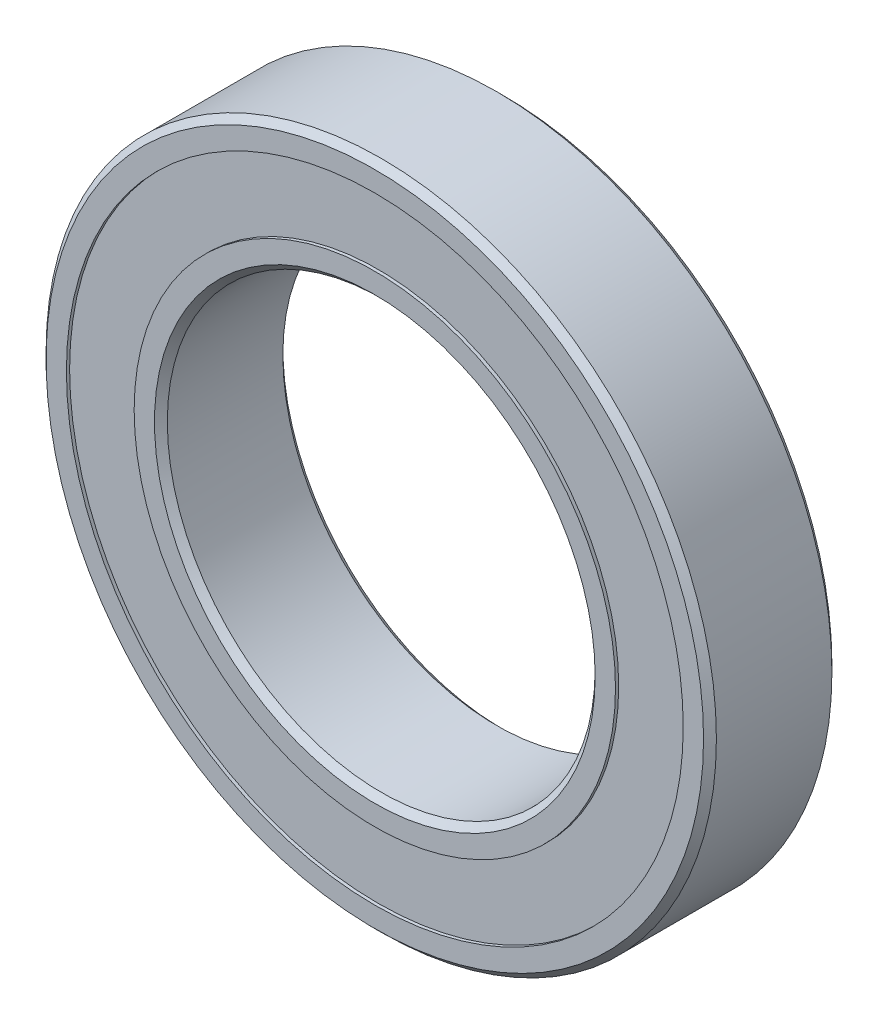
ISO-10303-21;
HEADER;
FILE_DESCRIPTION(('STEP AP214'),'2;1');
FILE_NAME('part.step','',(''),(''),'','','');
FILE_SCHEMA(('AUTOMOTIVE_DESIGN { 1 0 10303 214 1 1 1 1 }'));
ENDSEC;
DATA;
#1=APPLICATION_CONTEXT('core data for automotive mechanical design processes');
#2=APPLICATION_PROTOCOL_DEFINITION('international standard','automotive_design',2000,#1);
#3=PRODUCT_CONTEXT('',#1,'mechanical');
#4=PRODUCT('Part','Part','',(#3));
#5=PRODUCT_RELATED_PRODUCT_CATEGORY('part','',(#4));
#6=PRODUCT_DEFINITION_FORMATION('','',#4);
#7=PRODUCT_DEFINITION_CONTEXT('part definition',#1,'design');
#8=PRODUCT_DEFINITION('design','',#6,#7);
#9=PRODUCT_DEFINITION_SHAPE('','',#8);
#10=(LENGTH_UNIT() NAMED_UNIT(*) SI_UNIT(.MILLI.,.METRE.));
#11=(NAMED_UNIT(*) PLANE_ANGLE_UNIT() SI_UNIT($,.RADIAN.));
#12=(NAMED_UNIT(*) SI_UNIT($,.STERADIAN.) SOLID_ANGLE_UNIT());
#13=UNCERTAINTY_MEASURE_WITH_UNIT(LENGTH_MEASURE(1.E-05),#10,'distance_accuracy_value','');
#14=(GEOMETRIC_REPRESENTATION_CONTEXT(3) GLOBAL_UNCERTAINTY_ASSIGNED_CONTEXT((#13)) GLOBAL_UNIT_ASSIGNED_CONTEXT((#10,
#11,#12)) REPRESENTATION_CONTEXT('',''));
#15=CARTESIAN_POINT('',(0.,0.,0.));
#16=DIRECTION('',(0.,0.,1.));
#17=DIRECTION('',(1.,0.,0.));
#18=AXIS2_PLACEMENT_3D('',#15,#16,#17);
#19=CARTESIAN_POINT('',(0.,21.62475,-4.275));
#20=DIRECTION('',(0.,0.,1.));
#21=DIRECTION('',(1.,0.,0.));
#22=AXIS2_PLACEMENT_3D('',#19,#20,#21);
#23=PLANE('',#22);
#24=CARTESIAN_POINT('',(0.,0.,-4.275));
#25=DIRECTION('',(0.,0.,1.));
#26=DIRECTION('',(1.,0.,0.));
#27=AXIS2_PLACEMENT_3D('',#24,#25,#26);
#28=CIRCLE('',#27,21.62475);
#29=CARTESIAN_POINT('',(21.62475,0.,-4.275));
#30=VERTEX_POINT('',#29);
#31=EDGE_CURVE('E57',#30,#30,#28,.T.);
#32=ORIENTED_EDGE('',*,*,#31,.F.);
#33=EDGE_LOOP('',(#32));
#34=FACE_BOUND('',#33,.T.);
#35=CARTESIAN_POINT('',(0.,0.,-4.275));
#36=DIRECTION('',(0.,0.,1.));
#37=DIRECTION('',(1.,0.,0.));
#38=AXIS2_PLACEMENT_3D('',#35,#36,#37);
#39=CIRCLE('',#38,16.87475);
#40=CARTESIAN_POINT('',(16.87475,0.,-4.275));
#41=VERTEX_POINT('',#40);
#42=EDGE_CURVE('E11',#41,#41,#39,.T.);
#43=ORIENTED_EDGE('',*,*,#42,.T.);
#44=EDGE_LOOP('',(#43));
#45=FACE_BOUND('',#44,.T.);
#46=ADVANCED_FACE('F43',(#34,#45),#23,.F.);
#47=CARTESIAN_POINT('',(0.,0.,4.5));
#48=DIRECTION('',(0.,0.,1.));
#49=DIRECTION('',(1.,0.,0.));
#50=AXIS2_PLACEMENT_3D('',#47,#48,#49);
#51=CYLINDRICAL_SURFACE('',#50,16.87475);
#52=ORIENTED_EDGE('',*,*,#42,.F.);
#53=EDGE_LOOP('',(#52));
#54=FACE_BOUND('',#53,.T.);
#55=CARTESIAN_POINT('',(0.,0.,-3.10493558709355));
#56=DIRECTION('',(0.,0.,1.));
#57=DIRECTION('',(1.,0.,0.));
#58=AXIS2_PLACEMENT_3D('',#55,#56,#57);
#59=CIRCLE('',#58,16.87475);
#60=CARTESIAN_POINT('',(16.87475,0.,-3.10493558709355));
#61=VERTEX_POINT('',#60);
#62=EDGE_CURVE('E49',#61,#61,#59,.T.);
#63=ORIENTED_EDGE('',*,*,#62,.T.);
#64=EDGE_LOOP('',(#63));
#65=FACE_BOUND('',#64,.T.);
#66=ADVANCED_FACE('F66',(#54,#65),#51,.F.);
#67=CARTESIAN_POINT('',(0.,21.62475,-3.10493558709355));
#68=DIRECTION('',(0.,0.,-1.));
#69=DIRECTION('',(-1.,0.,0.));
#70=AXIS2_PLACEMENT_3D('',#67,#68,#69);
#71=PLANE('',#70);
#72=ORIENTED_EDGE('',*,*,#62,.F.);
#73=EDGE_LOOP('',(#72));
#74=FACE_BOUND('',#73,.T.);
#75=CARTESIAN_POINT('',(0.,0.,-3.10493558709355));
#76=DIRECTION('',(0.,0.,1.));
#77=DIRECTION('',(1.,0.,0.));
#78=AXIS2_PLACEMENT_3D('',#75,#76,#77);
#79=CIRCLE('',#78,21.62475);
#80=CARTESIAN_POINT('',(21.62475,0.,-3.10493558709355));
#81=VERTEX_POINT('',#80);
#82=EDGE_CURVE('E53',#81,#81,#79,.T.);
#83=ORIENTED_EDGE('',*,*,#82,.T.);
#84=EDGE_LOOP('',(#83));
#85=FACE_BOUND('',#84,.T.);
#86=ADVANCED_FACE('F70',(#74,#85),#71,.F.);
#87=CARTESIAN_POINT('',(0.,0.,4.5));
#88=DIRECTION('',(0.,0.,1.));
#89=DIRECTION('',(1.,0.,0.));
#90=AXIS2_PLACEMENT_3D('',#87,#88,#89);
#91=CYLINDRICAL_SURFACE('',#90,21.62475);
#92=ORIENTED_EDGE('',*,*,#82,.F.);
#93=EDGE_LOOP('',(#92));
#94=FACE_BOUND('',#93,.T.);
#95=ORIENTED_EDGE('',*,*,#31,.T.);
#96=EDGE_LOOP('',(#95));
#97=FACE_BOUND('',#96,.T.);
#98=ADVANCED_FACE('F63',(#94,#97),#91,.T.);
#99=CLOSED_SHELL('',(#46,#66,#86,#98));
#100=MANIFOLD_SOLID_BREP('B2',#99);
#101=CARTESIAN_POINT('',(0.,21.62475,4.275));
#102=DIRECTION('',(0.,0.,-1.));
#103=DIRECTION('',(-1.,0.,0.));
#104=AXIS2_PLACEMENT_3D('',#101,#102,#103);
#105=PLANE('',#104);
#106=CARTESIAN_POINT('',(0.,0.,4.275));
#107=DIRECTION('',(0.,0.,1.));
#108=DIRECTION('',(1.,0.,0.));
#109=AXIS2_PLACEMENT_3D('',#106,#107,#108);
#110=CIRCLE('',#109,16.87475);
#111=CARTESIAN_POINT('',(16.87475,0.,4.275));
#112=VERTEX_POINT('',#111);
#113=EDGE_CURVE('E42',#112,#112,#110,.T.);
#114=ORIENTED_EDGE('',*,*,#113,.F.);
#115=EDGE_LOOP('',(#114));
#116=FACE_BOUND('',#115,.T.);
#117=CARTESIAN_POINT('',(0.,0.,4.275));
#118=DIRECTION('',(0.,0.,1.));
#119=DIRECTION('',(1.,0.,0.));
#120=AXIS2_PLACEMENT_3D('',#117,#118,#119);
#121=CIRCLE('',#120,21.62475);
#122=CARTESIAN_POINT('',(21.62475,0.,4.275));
#123=VERTEX_POINT('',#122);
#124=EDGE_CURVE('E124',#123,#123,#121,.T.);
#125=ORIENTED_EDGE('',*,*,#124,.T.);
#126=EDGE_LOOP('',(#125));
#127=FACE_BOUND('',#126,.T.);
#128=ADVANCED_FACE('F110',(#116,#127),#105,.F.);
#129=CARTESIAN_POINT('',(0.,0.,4.5));
#130=DIRECTION('',(0.,0.,1.));
#131=DIRECTION('',(1.,0.,0.));
#132=AXIS2_PLACEMENT_3D('',#129,#130,#131);
#133=CYLINDRICAL_SURFACE('',#132,16.87475);
#134=CARTESIAN_POINT('',(0.,0.,3.10493558709355));
#135=DIRECTION('',(0.,0.,1.));
#136=DIRECTION('',(1.,0.,0.));
#137=AXIS2_PLACEMENT_3D('',#134,#135,#136);
#138=CIRCLE('',#137,16.87475);
#139=CARTESIAN_POINT('',(16.87475,0.,3.10493558709355));
#140=VERTEX_POINT('',#139);
#141=EDGE_CURVE('E116',#140,#140,#138,.T.);
#142=ORIENTED_EDGE('',*,*,#141,.F.);
#143=EDGE_LOOP('',(#142));
#144=FACE_BOUND('',#143,.T.);
#145=ORIENTED_EDGE('',*,*,#113,.T.);
#146=EDGE_LOOP('',(#145));
#147=FACE_BOUND('',#146,.T.);
#148=ADVANCED_FACE('F139',(#144,#147),#133,.F.);
#149=CARTESIAN_POINT('',(0.,21.62475,3.10493558709355));
#150=DIRECTION('',(0.,0.,1.));
#151=DIRECTION('',(1.,0.,0.));
#152=AXIS2_PLACEMENT_3D('',#149,#150,#151);
#153=PLANE('',#152);
#154=CARTESIAN_POINT('',(0.,0.,3.10493558709355));
#155=DIRECTION('',(0.,0.,1.));
#156=DIRECTION('',(1.,0.,0.));
#157=AXIS2_PLACEMENT_3D('',#154,#155,#156);
#158=CIRCLE('',#157,21.62475);
#159=CARTESIAN_POINT('',(21.62475,0.,3.10493558709355));
#160=VERTEX_POINT('',#159);
#161=EDGE_CURVE('E120',#160,#160,#158,.T.);
#162=ORIENTED_EDGE('',*,*,#161,.F.);
#163=EDGE_LOOP('',(#162));
#164=FACE_BOUND('',#163,.T.);
#165=ORIENTED_EDGE('',*,*,#141,.T.);
#166=EDGE_LOOP('',(#165));
#167=FACE_BOUND('',#166,.T.);
#168=ADVANCED_FACE('F134',(#164,#167),#153,.F.);
#169=CARTESIAN_POINT('',(0.,0.,4.5));
#170=DIRECTION('',(0.,0.,1.));
#171=DIRECTION('',(1.,0.,0.));
#172=AXIS2_PLACEMENT_3D('',#169,#170,#171);
#173=CYLINDRICAL_SURFACE('',#172,21.62475);
#174=ORIENTED_EDGE('',*,*,#124,.F.);
#175=EDGE_LOOP('',(#174));
#176=FACE_BOUND('',#175,.T.);
#177=ORIENTED_EDGE('',*,*,#161,.T.);
#178=EDGE_LOOP('',(#177));
#179=FACE_BOUND('',#178,.T.);
#180=ADVANCED_FACE('F131',(#176,#179),#173,.T.);
#181=CLOSED_SHELL('',(#128,#148,#168,#180));
#182=MANIFOLD_SOLID_BREP('B6',#181);
#183=CARTESIAN_POINT('',(-9.62487499999979,16.6707725164996,0.));
#184=DIRECTION('',(0.,0.,1.));
#185=DIRECTION('',(-0.499999999999989,0.866025403784445,0.));
#186=AXIS2_PLACEMENT_3D('',#183,#184,#185);
#187=SPHERICAL_SURFACE('',#186,3.10493558709355);
#188=CARTESIAN_POINT('',(-9.62487499999979,16.6707725164996,3.10493558709355));
#189=VERTEX_POINT('',#188);
#190=VERTEX_LOOP('',#189);
#191=FACE_BOUND('',#190,.T.);
#192=ADVANCED_FACE('F177',(#191),#187,.T.);
#193=CLOSED_SHELL('',(#192));
#194=MANIFOLD_SOLID_BREP('B37',#193);
#195=CARTESIAN_POINT('',(-16.6707725164994,9.6248750000002,0.));
#196=DIRECTION('',(0.,0.,1.));
#197=DIRECTION('',(-0.866025403784433,0.50000000000001,0.));
#198=AXIS2_PLACEMENT_3D('',#195,#196,#197);
#199=SPHERICAL_SURFACE('',#198,3.10493558709355);
#200=CARTESIAN_POINT('',(-16.6707725164994,9.6248750000002,3.10493558709355));
#201=VERTEX_POINT('',#200);
#202=VERTEX_LOOP('',#201);
#203=FACE_BOUND('',#202,.T.);
#204=ADVANCED_FACE('F197',(#203),#199,.T.);
#205=CLOSED_SHELL('',(#204));
#206=MANIFOLD_SOLID_BREP('B106',#205);
#207=CARTESIAN_POINT('',(-19.24975,2.01630428707187E-13,0.));
#208=DIRECTION('',(0.,0.,1.));
#209=DIRECTION('',(-1.,0.,0.));
#210=AXIS2_PLACEMENT_3D('',#207,#208,#209);
#211=SPHERICAL_SURFACE('',#210,3.10493558709355);
#212=CARTESIAN_POINT('',(-19.24975,2.01630428707187E-13,3.10493558709355));
#213=VERTEX_POINT('',#212);
#214=VERTEX_LOOP('',#213);
#215=FACE_BOUND('',#214,.T.);
#216=ADVANCED_FACE('F217',(#215),#211,.T.);
#217=CLOSED_SHELL('',(#216));
#218=MANIFOLD_SOLID_BREP('B173',#217);
#219=CARTESIAN_POINT('',(-16.6707725164996,-9.62487499999985,0.));
#220=DIRECTION('',(0.,0.,1.));
#221=DIRECTION('',(-0.866025403784443,-0.499999999999992,0.));
#222=AXIS2_PLACEMENT_3D('',#219,#220,#221);
#223=SPHERICAL_SURFACE('',#222,3.10493558709355);
#224=CARTESIAN_POINT('',(-16.6707725164996,-9.62487499999985,3.10493558709355));
#225=VERTEX_POINT('',#224);
#226=VERTEX_LOOP('',#225);
#227=FACE_BOUND('',#226,.T.);
#228=ADVANCED_FACE('F237',(#227),#223,.T.);
#229=CLOSED_SHELL('',(#228));
#230=MANIFOLD_SOLID_BREP('B193',#229);
#231=CARTESIAN_POINT('',(-9.62487500000014,-16.6707725164994,0.));
#232=DIRECTION('',(0.,0.,1.));
#233=DIRECTION('',(-0.500000000000007,-0.866025403784435,0.));
#234=AXIS2_PLACEMENT_3D('',#231,#232,#233);
#235=SPHERICAL_SURFACE('',#234,3.10493558709355);
#236=CARTESIAN_POINT('',(-9.62487500000014,-16.6707725164994,3.10493558709355));
#237=VERTEX_POINT('',#236);
#238=VERTEX_LOOP('',#237);
#239=FACE_BOUND('',#238,.T.);
#240=ADVANCED_FACE('F257',(#239),#235,.T.);
#241=CLOSED_SHELL('',(#240));
#242=MANIFOLD_SOLID_BREP('B213',#241);
#243=CARTESIAN_POINT('',(-1.34420285804791E-13,-19.24975,0.));
#244=DIRECTION('',(0.,0.,1.));
#245=DIRECTION('',(0.,-1.,0.));
#246=AXIS2_PLACEMENT_3D('',#243,#244,#245);
#247=SPHERICAL_SURFACE('',#246,3.10493558709355);
#248=CARTESIAN_POINT('',(-1.34420285804791E-13,-19.24975,3.10493558709355));
#249=VERTEX_POINT('',#248);
#250=VERTEX_LOOP('',#249);
#251=FACE_BOUND('',#250,.T.);
#252=ADVANCED_FACE('F277',(#251),#247,.T.);
#253=CLOSED_SHELL('',(#252));
#254=MANIFOLD_SOLID_BREP('B233',#253);
#255=CARTESIAN_POINT('',(9.6248749999999,-16.6707725164996,0.));
#256=DIRECTION('',(0.,0.,1.));
#257=DIRECTION('',(0.499999999999995,-0.866025403784442,0.));
#258=AXIS2_PLACEMENT_3D('',#255,#256,#257);
#259=SPHERICAL_SURFACE('',#258,3.10493558709355);
#260=CARTESIAN_POINT('',(9.6248749999999,-16.6707725164996,3.10493558709355));
#261=VERTEX_POINT('',#260);
#262=VERTEX_LOOP('',#261);
#263=FACE_BOUND('',#262,.T.);
#264=ADVANCED_FACE('F297',(#263),#259,.T.);
#265=CLOSED_SHELL('',(#264));
#266=MANIFOLD_SOLID_BREP('B253',#265);
#267=CARTESIAN_POINT('',(16.6707725164995,-9.62487500000008,0.));
#268=DIRECTION('',(0.,0.,1.));
#269=DIRECTION('',(0.866025403784436,-0.500000000000004,0.));
#270=AXIS2_PLACEMENT_3D('',#267,#268,#269);
#271=SPHERICAL_SURFACE('',#270,3.10493558709355);
#272=CARTESIAN_POINT('',(16.6707725164995,-9.62487500000008,3.10493558709355));
#273=VERTEX_POINT('',#272);
#274=VERTEX_LOOP('',#273);
#275=FACE_BOUND('',#274,.T.);
#276=ADVANCED_FACE('F317',(#275),#271,.T.);
#277=CLOSED_SHELL('',(#276));
#278=MANIFOLD_SOLID_BREP('B273',#277);
#279=CARTESIAN_POINT('',(19.24975,0.,0.));
#280=DIRECTION('',(0.,0.,1.));
#281=DIRECTION('',(1.,0.,0.));
#282=AXIS2_PLACEMENT_3D('',#279,#280,#281);
#283=SPHERICAL_SURFACE('',#282,3.10493558709355);
#284=CARTESIAN_POINT('',(19.24975,0.,3.10493558709355));
#285=VERTEX_POINT('',#284);
#286=VERTEX_LOOP('',#285);
#287=FACE_BOUND('',#286,.T.);
#288=ADVANCED_FACE('F337',(#287),#283,.T.);
#289=CLOSED_SHELL('',(#288));
#290=MANIFOLD_SOLID_BREP('B293',#289);
#291=CARTESIAN_POINT('',(16.6707725164995,9.62487499999996,0.));
#292=DIRECTION('',(0.,0.,1.));
#293=DIRECTION('',(0.86602540378444,0.499999999999998,0.));
#294=AXIS2_PLACEMENT_3D('',#291,#292,#293);
#295=SPHERICAL_SURFACE('',#294,3.10493558709355);
#296=CARTESIAN_POINT('',(16.6707725164995,9.62487499999996,3.10493558709355));
#297=VERTEX_POINT('',#296);
#298=VERTEX_LOOP('',#297);
#299=FACE_BOUND('',#298,.T.);
#300=ADVANCED_FACE('F357',(#299),#295,.T.);
#301=CLOSED_SHELL('',(#300));
#302=MANIFOLD_SOLID_BREP('B313',#301);
#303=CARTESIAN_POINT('',(9.62487500000002,16.6707725164995,0.));
#304=DIRECTION('',(0.,0.,1.));
#305=DIRECTION('',(0.500000000000001,0.866025403784438,0.));
#306=AXIS2_PLACEMENT_3D('',#303,#304,#305);
#307=SPHERICAL_SURFACE('',#306,3.10493558709355);
#308=CARTESIAN_POINT('',(9.62487500000002,16.6707725164995,3.10493558709355));
#309=VERTEX_POINT('',#308);
#310=VERTEX_LOOP('',#309);
#311=FACE_BOUND('',#310,.T.);
#312=ADVANCED_FACE('F377',(#311),#307,.T.);
#313=CLOSED_SHELL('',(#312));
#314=MANIFOLD_SOLID_BREP('B333',#313);
#315=CARTESIAN_POINT('',(0.,19.24975,0.));
#316=DIRECTION('',(0.,0.,1.));
#317=DIRECTION('',(0.,1.,0.));
#318=AXIS2_PLACEMENT_3D('',#315,#316,#317);
#319=SPHERICAL_SURFACE('',#318,3.10493558709355);
#320=CARTESIAN_POINT('',(0.,19.24975,3.10493558709355));
#321=VERTEX_POINT('',#320);
#322=VERTEX_LOOP('',#321);
#323=FACE_BOUND('',#322,.T.);
#324=ADVANCED_FACE('F399',(#323),#319,.T.);
#325=CLOSED_SHELL('',(#324));
#326=MANIFOLD_SOLID_BREP('B353',#325);
#327=CARTESIAN_POINT('',(0.,0.,4.5));
#328=DIRECTION('',(0.,0.,1.));
#329=DIRECTION('',(1.,0.,0.));
#330=AXIS2_PLACEMENT_3D('',#327,#328,#329);
#331=CONICAL_SURFACE('',#330,15.4495,0.785398163397449);
#332=CARTESIAN_POINT('',(0.,0.,4.05));
#333=DIRECTION('',(0.,0.,1.));
#334=DIRECTION('',(1.,0.,0.));
#335=AXIS2_PLACEMENT_3D('',#332,#333,#334);
#336=CIRCLE('',#335,14.9995);
#337=CARTESIAN_POINT('',(14.9995,0.,4.05));
#338=VERTEX_POINT('',#337);
#339=EDGE_CURVE('E398',#338,#338,#336,.T.);
#340=ORIENTED_EDGE('',*,*,#339,.F.);
#341=EDGE_LOOP('',(#340));
#342=FACE_BOUND('',#341,.T.);
#343=CARTESIAN_POINT('',(0.,0.,4.5));
#344=DIRECTION('',(0.,0.,1.));
#345=DIRECTION('',(1.,0.,0.));
#346=AXIS2_PLACEMENT_3D('',#343,#344,#345);
#347=CIRCLE('',#346,15.4495);
#348=CARTESIAN_POINT('',(15.4495,0.,4.5));
#349=VERTEX_POINT('',#348);
#350=EDGE_CURVE('E446',#349,#349,#347,.T.);
#351=ORIENTED_EDGE('',*,*,#350,.T.);
#352=EDGE_LOOP('',(#351));
#353=FACE_BOUND('',#352,.T.);
#354=ADVANCED_FACE('F418',(#342,#353),#331,.F.);
#355=CARTESIAN_POINT('',(0.,0.,4.5));
#356=DIRECTION('',(0.,0.,1.));
#357=DIRECTION('',(1.,0.,0.));
#358=AXIS2_PLACEMENT_3D('',#355,#356,#357);
#359=CYLINDRICAL_SURFACE('',#358,14.9995);
#360=CARTESIAN_POINT('',(0.,0.,-4.05));
#361=DIRECTION('',(0.,0.,1.));
#362=DIRECTION('',(1.,0.,0.));
#363=AXIS2_PLACEMENT_3D('',#360,#361,#362);
#364=CIRCLE('',#363,14.9995);
#365=CARTESIAN_POINT('',(14.9995,0.,-4.05));
#366=VERTEX_POINT('',#365);
#367=EDGE_CURVE('E424',#366,#366,#364,.T.);
#368=ORIENTED_EDGE('',*,*,#367,.F.);
#369=EDGE_LOOP('',(#368));
#370=FACE_BOUND('',#369,.T.);
#371=ORIENTED_EDGE('',*,*,#339,.T.);
#372=EDGE_LOOP('',(#371));
#373=FACE_BOUND('',#372,.T.);
#374=ADVANCED_FACE('F483',(#370,#373),#359,.F.);
#375=CARTESIAN_POINT('',(0.,0.,-4.05));
#376=DIRECTION('',(0.,0.,-1.));
#377=DIRECTION('',(-1.,0.,0.));
#378=AXIS2_PLACEMENT_3D('',#375,#376,#377);
#379=CONICAL_SURFACE('',#378,14.9995,0.78539816339745);
#380=CARTESIAN_POINT('',(0.,0.,-4.5));
#381=DIRECTION('',(0.,0.,1.));
#382=DIRECTION('',(1.,0.,0.));
#383=AXIS2_PLACEMENT_3D('',#380,#381,#382);
#384=CIRCLE('',#383,15.4495);
#385=CARTESIAN_POINT('',(15.4495,0.,-4.5));
#386=VERTEX_POINT('',#385);
#387=EDGE_CURVE('E428',#386,#386,#384,.T.);
#388=ORIENTED_EDGE('',*,*,#387,.F.);
#389=EDGE_LOOP('',(#388));
#390=FACE_BOUND('',#389,.T.);
#391=ORIENTED_EDGE('',*,*,#367,.T.);
#392=EDGE_LOOP('',(#391));
#393=FACE_BOUND('',#392,.T.);
#394=ADVANCED_FACE('F478',(#390,#393),#379,.F.);
#395=CARTESIAN_POINT('',(0.,15.4495,-4.5));
#396=DIRECTION('',(0.,0.,1.));
#397=DIRECTION('',(1.,0.,0.));
#398=AXIS2_PLACEMENT_3D('',#395,#396,#397);
#399=PLANE('',#398);
#400=CARTESIAN_POINT('',(0.,0.,-4.5));
#401=DIRECTION('',(0.,0.,1.));
#402=DIRECTION('',(1.,0.,0.));
#403=AXIS2_PLACEMENT_3D('',#400,#401,#402);
#404=CIRCLE('',#403,16.87475);
#405=CARTESIAN_POINT('',(16.87475,0.,-4.5));
#406=VERTEX_POINT('',#405);
#407=EDGE_CURVE('E432',#406,#406,#404,.T.);
#408=ORIENTED_EDGE('',*,*,#407,.F.);
#409=EDGE_LOOP('',(#408));
#410=FACE_BOUND('',#409,.T.);
#411=ORIENTED_EDGE('',*,*,#387,.T.);
#412=EDGE_LOOP('',(#411));
#413=FACE_BOUND('',#412,.T.);
#414=ADVANCED_FACE('F472',(#410,#413),#399,.F.);
#415=CARTESIAN_POINT('',(0.,0.,4.5));
#416=DIRECTION('',(0.,0.,1.));
#417=DIRECTION('',(1.,0.,0.));
#418=AXIS2_PLACEMENT_3D('',#415,#416,#417);
#419=CYLINDRICAL_SURFACE('',#418,16.87475);
#420=CARTESIAN_POINT('',(0.,0.,-2.));
#421=DIRECTION('',(0.,0.,1.));
#422=DIRECTION('',(1.,0.,0.));
#423=AXIS2_PLACEMENT_3D('',#420,#421,#422);
#424=CIRCLE('',#423,16.87475);
#425=CARTESIAN_POINT('',(16.87475,0.,-2.));
#426=VERTEX_POINT('',#425);
#427=EDGE_CURVE('E437',#426,#426,#424,.T.);
#428=ORIENTED_EDGE('',*,*,#427,.F.);
#429=EDGE_LOOP('',(#428));
#430=FACE_BOUND('',#429,.T.);
#431=ORIENTED_EDGE('',*,*,#407,.T.);
#432=EDGE_LOOP('',(#431));
#433=FACE_BOUND('',#432,.T.);
#434=ADVANCED_FACE('F466',(#430,#433),#419,.T.);
#435=CARTESIAN_POINT('',(0.,0.,0.));
#436=DIRECTION('',(0.,0.,1.));
#437=DIRECTION('',(1.,0.,0.));
#438=AXIS2_PLACEMENT_3D('',#435,#436,#437);
#439=TOROIDAL_SURFACE('',#438,19.24975,3.10493558709355);
#440=CARTESIAN_POINT('',(0.,0.,2.));
#441=DIRECTION('',(0.,0.,1.));
#442=DIRECTION('',(1.,0.,0.));
#443=AXIS2_PLACEMENT_3D('',#440,#441,#442);
#444=CIRCLE('',#443,16.87475);
#445=CARTESIAN_POINT('',(16.87475,0.,2.));
#446=VERTEX_POINT('',#445);
#447=EDGE_CURVE('E440',#446,#446,#444,.T.);
#448=ORIENTED_EDGE('',*,*,#447,.F.);
#449=EDGE_LOOP('',(#448));
#450=FACE_BOUND('',#449,.T.);
#451=ORIENTED_EDGE('',*,*,#427,.T.);
#452=EDGE_LOOP('',(#451));
#453=FACE_BOUND('',#452,.T.);
#454=ADVANCED_FACE('F460',(#450,#453),#439,.F.);
#455=CARTESIAN_POINT('',(0.,0.,4.5));
#456=DIRECTION('',(0.,0.,1.));
#457=DIRECTION('',(1.,0.,0.));
#458=AXIS2_PLACEMENT_3D('',#455,#456,#457);
#459=CYLINDRICAL_SURFACE('',#458,16.87475);
#460=CARTESIAN_POINT('',(0.,0.,4.5));
#461=DIRECTION('',(0.,0.,1.));
#462=DIRECTION('',(1.,0.,0.));
#463=AXIS2_PLACEMENT_3D('',#460,#461,#462);
#464=CIRCLE('',#463,16.87475);
#465=CARTESIAN_POINT('',(16.87475,0.,4.5));
#466=VERTEX_POINT('',#465);
#467=EDGE_CURVE('E443',#466,#466,#464,.T.);
#468=ORIENTED_EDGE('',*,*,#467,.F.);
#469=EDGE_LOOP('',(#468));
#470=FACE_BOUND('',#469,.T.);
#471=ORIENTED_EDGE('',*,*,#447,.T.);
#472=EDGE_LOOP('',(#471));
#473=FACE_BOUND('',#472,.T.);
#474=ADVANCED_FACE('F454',(#470,#473),#459,.T.);
#475=CARTESIAN_POINT('',(0.,15.4495,4.5));
#476=DIRECTION('',(0.,0.,-1.));
#477=DIRECTION('',(-1.,0.,0.));
#478=AXIS2_PLACEMENT_3D('',#475,#476,#477);
#479=PLANE('',#478);
#480=ORIENTED_EDGE('',*,*,#350,.F.);
#481=EDGE_LOOP('',(#480));
#482=FACE_BOUND('',#481,.T.);
#483=ORIENTED_EDGE('',*,*,#467,.T.);
#484=EDGE_LOOP('',(#483));
#485=FACE_BOUND('',#484,.T.);
#486=ADVANCED_FACE('F451',(#482,#485),#479,.F.);
#487=CLOSED_SHELL('',(#354,#374,#394,#414,#434,#454,#474,#486));
#488=MANIFOLD_SOLID_BREP('B373',#487);
#489=CARTESIAN_POINT('',(0.,0.,4.05));
#490=DIRECTION('',(0.,0.,-1.));
#491=DIRECTION('',(-1.,0.,0.));
#492=AXIS2_PLACEMENT_3D('',#489,#490,#491);
#493=CONICAL_SURFACE('',#492,23.5,0.785398163397451);
#494=CARTESIAN_POINT('',(0.,0.,4.5));
#495=DIRECTION('',(0.,0.,1.));
#496=DIRECTION('',(1.,0.,0.));
#497=AXIS2_PLACEMENT_3D('',#494,#495,#496);
#498=CIRCLE('',#497,23.05);
#499=CARTESIAN_POINT('',(23.05,0.,4.5));
#500=VERTEX_POINT('',#499);
#501=EDGE_CURVE('E417',#500,#500,#498,.T.);
#502=ORIENTED_EDGE('',*,*,#501,.F.);
#503=EDGE_LOOP('',(#502));
#504=FACE_BOUND('',#503,.T.);
#505=CARTESIAN_POINT('',(0.,0.,4.05));
#506=DIRECTION('',(0.,0.,1.));
#507=DIRECTION('',(1.,0.,0.));
#508=AXIS2_PLACEMENT_3D('',#505,#506,#507);
#509=CIRCLE('',#508,23.5);
#510=CARTESIAN_POINT('',(23.5,0.,4.05));
#511=VERTEX_POINT('',#510);
#512=EDGE_CURVE('E567',#511,#511,#509,.T.);
#513=ORIENTED_EDGE('',*,*,#512,.T.);
#514=EDGE_LOOP('',(#513));
#515=FACE_BOUND('',#514,.T.);
#516=ADVANCED_FACE('F539',(#504,#515),#493,.T.);
#517=CARTESIAN_POINT('',(0.,23.05,4.5));
#518=DIRECTION('',(0.,0.,-1.));
#519=DIRECTION('',(-1.,0.,0.));
#520=AXIS2_PLACEMENT_3D('',#517,#518,#519);
#521=PLANE('',#520);
#522=CARTESIAN_POINT('',(0.,0.,4.5));
#523=DIRECTION('',(0.,0.,1.));
#524=DIRECTION('',(1.,0.,0.));
#525=AXIS2_PLACEMENT_3D('',#522,#523,#524);
#526=CIRCLE('',#525,21.62475);
#527=CARTESIAN_POINT('',(21.62475,0.,4.5));
#528=VERTEX_POINT('',#527);
#529=EDGE_CURVE('E545',#528,#528,#526,.T.);
#530=ORIENTED_EDGE('',*,*,#529,.F.);
#531=EDGE_LOOP('',(#530));
#532=FACE_BOUND('',#531,.T.);
#533=ORIENTED_EDGE('',*,*,#501,.T.);
#534=EDGE_LOOP('',(#533));
#535=FACE_BOUND('',#534,.T.);
#536=ADVANCED_FACE('F604',(#532,#535),#521,.F.);
#537=CARTESIAN_POINT('',(0.,0.,4.5));
#538=DIRECTION('',(0.,0.,1.));
#539=DIRECTION('',(1.,0.,0.));
#540=AXIS2_PLACEMENT_3D('',#537,#538,#539);
#541=CYLINDRICAL_SURFACE('',#540,21.62475);
#542=CARTESIAN_POINT('',(0.,0.,2.));
#543=DIRECTION('',(0.,0.,1.));
#544=DIRECTION('',(1.,0.,0.));
#545=AXIS2_PLACEMENT_3D('',#542,#543,#544);
#546=CIRCLE('',#545,21.62475);
#547=CARTESIAN_POINT('',(21.62475,0.,2.));
#548=VERTEX_POINT('',#547);
#549=EDGE_CURVE('E549',#548,#548,#546,.T.);
#550=ORIENTED_EDGE('',*,*,#549,.F.);
#551=EDGE_LOOP('',(#550));
#552=FACE_BOUND('',#551,.T.);
#553=ORIENTED_EDGE('',*,*,#529,.T.);
#554=EDGE_LOOP('',(#553));
#555=FACE_BOUND('',#554,.T.);
#556=ADVANCED_FACE('F599',(#552,#555),#541,.F.);
#557=CARTESIAN_POINT('',(0.,0.,0.));
#558=DIRECTION('',(0.,0.,1.));
#559=DIRECTION('',(1.,0.,0.));
#560=AXIS2_PLACEMENT_3D('',#557,#558,#559);
#561=TOROIDAL_SURFACE('',#560,19.24975,3.10493558709355);
#562=CARTESIAN_POINT('',(0.,0.,-2.));
#563=DIRECTION('',(0.,0.,1.));
#564=DIRECTION('',(1.,0.,0.));
#565=AXIS2_PLACEMENT_3D('',#562,#563,#564);
#566=CIRCLE('',#565,21.62475);
#567=CARTESIAN_POINT('',(21.62475,0.,-2.));
#568=VERTEX_POINT('',#567);
#569=EDGE_CURVE('E553',#568,#568,#566,.T.);
#570=ORIENTED_EDGE('',*,*,#569,.F.);
#571=EDGE_LOOP('',(#570));
#572=FACE_BOUND('',#571,.T.);
#573=ORIENTED_EDGE('',*,*,#549,.T.);
#574=EDGE_LOOP('',(#573));
#575=FACE_BOUND('',#574,.T.);
#576=ADVANCED_FACE('F593',(#572,#575),#561,.F.);
#577=CARTESIAN_POINT('',(0.,0.,4.5));
#578=DIRECTION('',(0.,0.,1.));
#579=DIRECTION('',(1.,0.,0.));
#580=AXIS2_PLACEMENT_3D('',#577,#578,#579);
#581=CYLINDRICAL_SURFACE('',#580,21.62475);
#582=CARTESIAN_POINT('',(0.,0.,-4.5));
#583=DIRECTION('',(0.,0.,1.));
#584=DIRECTION('',(1.,0.,0.));
#585=AXIS2_PLACEMENT_3D('',#582,#583,#584);
#586=CIRCLE('',#585,21.62475);
#587=CARTESIAN_POINT('',(21.62475,0.,-4.5));
#588=VERTEX_POINT('',#587);
#589=EDGE_CURVE('E558',#588,#588,#586,.T.);
#590=ORIENTED_EDGE('',*,*,#589,.F.);
#591=EDGE_LOOP('',(#590));
#592=FACE_BOUND('',#591,.T.);
#593=ORIENTED_EDGE('',*,*,#569,.T.);
#594=EDGE_LOOP('',(#593));
#595=FACE_BOUND('',#594,.T.);
#596=ADVANCED_FACE('F587',(#592,#595),#581,.F.);
#597=CARTESIAN_POINT('',(0.,23.05,-4.5));
#598=DIRECTION('',(0.,0.,1.));
#599=DIRECTION('',(1.,0.,0.));
#600=AXIS2_PLACEMENT_3D('',#597,#598,#599);
#601=PLANE('',#600);
#602=CARTESIAN_POINT('',(0.,0.,-4.5));
#603=DIRECTION('',(0.,0.,1.));
#604=DIRECTION('',(1.,0.,0.));
#605=AXIS2_PLACEMENT_3D('',#602,#603,#604);
#606=CIRCLE('',#605,23.05);
#607=CARTESIAN_POINT('',(23.05,0.,-4.5));
#608=VERTEX_POINT('',#607);
#609=EDGE_CURVE('E561',#608,#608,#606,.T.);
#610=ORIENTED_EDGE('',*,*,#609,.F.);
#611=EDGE_LOOP('',(#610));
#612=FACE_BOUND('',#611,.T.);
#613=ORIENTED_EDGE('',*,*,#589,.T.);
#614=EDGE_LOOP('',(#613));
#615=FACE_BOUND('',#614,.T.);
#616=ADVANCED_FACE('F581',(#612,#615),#601,.F.);
#617=CARTESIAN_POINT('',(0.,0.,-4.5));
#618=DIRECTION('',(0.,0.,1.));
#619=DIRECTION('',(1.,0.,0.));
#620=AXIS2_PLACEMENT_3D('',#617,#618,#619);
#621=CONICAL_SURFACE('',#620,23.05,0.785398163397452);
#622=CARTESIAN_POINT('',(0.,0.,-4.05));
#623=DIRECTION('',(0.,0.,1.));
#624=DIRECTION('',(1.,0.,0.));
#625=AXIS2_PLACEMENT_3D('',#622,#623,#624);
#626=CIRCLE('',#625,23.5);
#627=CARTESIAN_POINT('',(23.5,0.,-4.05));
#628=VERTEX_POINT('',#627);
#629=EDGE_CURVE('E564',#628,#628,#626,.T.);
#630=ORIENTED_EDGE('',*,*,#629,.F.);
#631=EDGE_LOOP('',(#630));
#632=FACE_BOUND('',#631,.T.);
#633=ORIENTED_EDGE('',*,*,#609,.T.);
#634=EDGE_LOOP('',(#633));
#635=FACE_BOUND('',#634,.T.);
#636=ADVANCED_FACE('F575',(#632,#635),#621,.T.);
#637=CARTESIAN_POINT('',(0.,0.,4.5));
#638=DIRECTION('',(0.,0.,1.));
#639=DIRECTION('',(1.,0.,0.));
#640=AXIS2_PLACEMENT_3D('',#637,#638,#639);
#641=CYLINDRICAL_SURFACE('',#640,23.5);
#642=ORIENTED_EDGE('',*,*,#512,.F.);
#643=EDGE_LOOP('',(#642));
#644=FACE_BOUND('',#643,.T.);
#645=ORIENTED_EDGE('',*,*,#629,.T.);
#646=EDGE_LOOP('',(#645));
#647=FACE_BOUND('',#646,.T.);
#648=ADVANCED_FACE('F572',(#644,#647),#641,.T.);
#649=CLOSED_SHELL('',(#516,#536,#556,#576,#596,#616,#636,#648));
#650=MANIFOLD_SOLID_BREP('B393',#649);
#651=ADVANCED_BREP_SHAPE_REPRESENTATION('',(#18,#100,#182,#194,#206,#218,#230,#242,#254,#266,
#278,#290,#302,#314,#326,#488,#650),#14);
#652=SHAPE_DEFINITION_REPRESENTATION(#9,#651);
ENDSEC;
END-ISO-10303-21;
